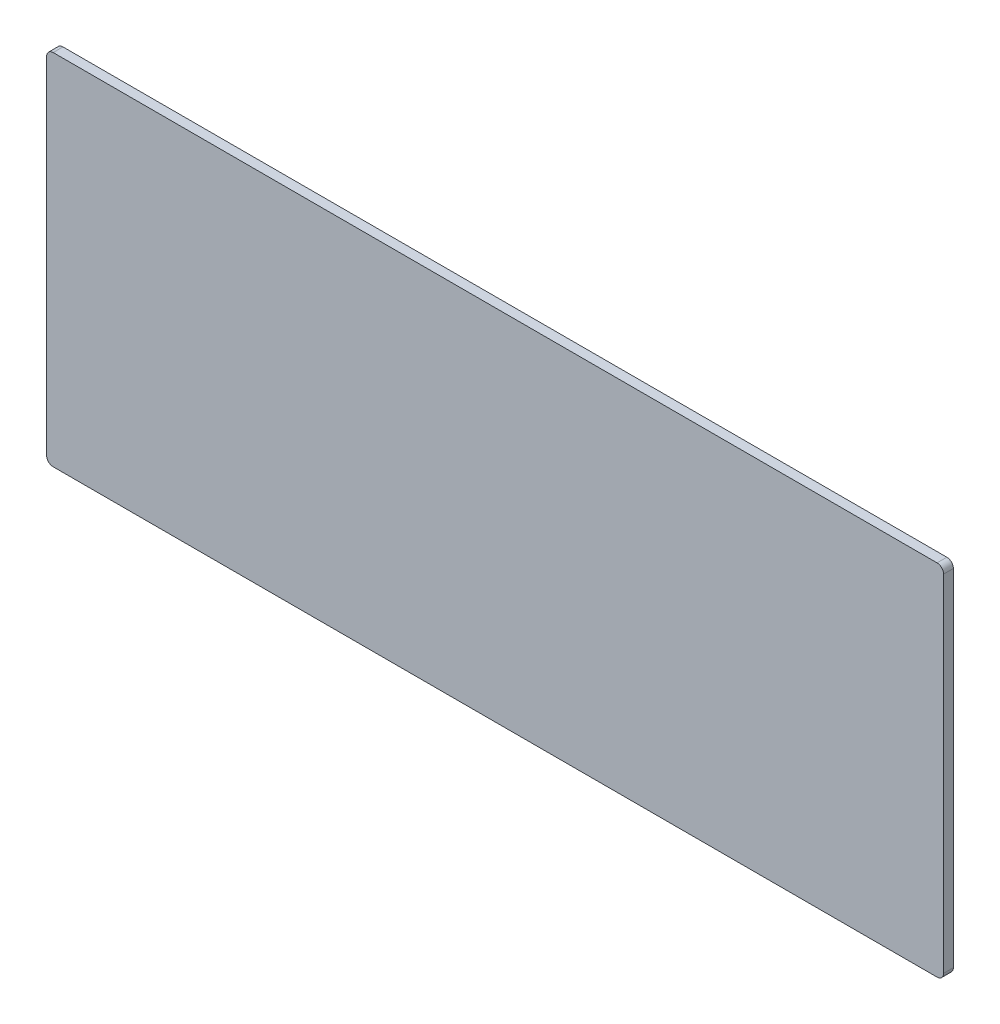
ISO-10303-21;
HEADER;
FILE_DESCRIPTION(('STEP AP214'),'2;1');
FILE_NAME('part.step','',(''),(''),'','','');
FILE_SCHEMA(('AUTOMOTIVE_DESIGN { 1 0 10303 214 1 1 1 1 }'));
ENDSEC;
DATA;
#1=APPLICATION_CONTEXT('core data for automotive mechanical design processes');
#2=APPLICATION_PROTOCOL_DEFINITION('international standard','automotive_design',2000,#1);
#3=PRODUCT_CONTEXT('',#1,'mechanical');
#4=PRODUCT('Part','Part','',(#3));
#5=PRODUCT_RELATED_PRODUCT_CATEGORY('part','',(#4));
#6=PRODUCT_DEFINITION_FORMATION('','',#4);
#7=PRODUCT_DEFINITION_CONTEXT('part definition',#1,'design');
#8=PRODUCT_DEFINITION('design','',#6,#7);
#9=PRODUCT_DEFINITION_SHAPE('','',#8);
#10=(LENGTH_UNIT() NAMED_UNIT(*) SI_UNIT(.MILLI.,.METRE.));
#11=(NAMED_UNIT(*) PLANE_ANGLE_UNIT() SI_UNIT($,.RADIAN.));
#12=(NAMED_UNIT(*) SI_UNIT($,.STERADIAN.) SOLID_ANGLE_UNIT());
#13=UNCERTAINTY_MEASURE_WITH_UNIT(LENGTH_MEASURE(1.E-05),#10,'distance_accuracy_value','');
#14=(GEOMETRIC_REPRESENTATION_CONTEXT(3) GLOBAL_UNCERTAINTY_ASSIGNED_CONTEXT((#13)) GLOBAL_UNIT_ASSIGNED_CONTEXT((#10,
#11,#12)) REPRESENTATION_CONTEXT('',''));
#15=CARTESIAN_POINT('',(0.,0.,0.));
#16=DIRECTION('',(0.,0.,1.));
#17=DIRECTION('',(1.,0.,0.));
#18=AXIS2_PLACEMENT_3D('',#15,#16,#17);
#19=CARTESIAN_POINT('',(-135.5,-35.4960998439938,-3.));
#20=DIRECTION('',(0.,0.,1.));
#21=DIRECTION('',(1.,0.,0.));
#22=AXIS2_PLACEMENT_3D('',#19,#20,#21);
#23=CYLINDRICAL_SURFACE('',#22,2.);
#24=CARTESIAN_POINT('',(-135.5,-35.4960998439938,0.));
#25=DIRECTION('',(0.,0.,1.));
#26=DIRECTION('',(1.,0.,0.));
#27=AXIS2_PLACEMENT_3D('',#24,#25,#26);
#28=CIRCLE('',#27,2.);
#29=CARTESIAN_POINT('',(-137.5,-35.4960998439938,0.));
#30=VERTEX_POINT('',#29);
#31=CARTESIAN_POINT('',(-135.5,-37.4960998439938,0.));
#32=VERTEX_POINT('',#31);
#33=EDGE_CURVE('E133',#30,#32,#28,.T.);
#34=ORIENTED_EDGE('',*,*,#33,.F.);
#35=DIRECTION('',(0.,0.,1.));
#36=VECTOR('',#35,1.);
#37=CARTESIAN_POINT('',(-137.5,-35.4960998439938,-3.));
#38=LINE('',#37,#36);
#39=CARTESIAN_POINT('',(-137.5,-35.4960998439938,-3.));
#40=VERTEX_POINT('',#39);
#41=EDGE_CURVE('E11',#40,#30,#38,.T.);
#42=ORIENTED_EDGE('',*,*,#41,.F.);
#43=CARTESIAN_POINT('',(-135.5,-35.4960998439938,-3.));
#44=DIRECTION('',(0.,0.,1.));
#45=DIRECTION('',(1.,0.,0.));
#46=AXIS2_PLACEMENT_3D('',#43,#44,#45);
#47=CIRCLE('',#46,2.);
#48=CARTESIAN_POINT('',(-135.5,-37.4960998439938,-3.));
#49=VERTEX_POINT('',#48);
#50=EDGE_CURVE('E153',#40,#49,#47,.T.);
#51=ORIENTED_EDGE('',*,*,#50,.T.);
#52=DIRECTION('',(0.,0.,1.));
#53=VECTOR('',#52,1.);
#54=CARTESIAN_POINT('',(-135.5,-37.4960998439938,-3.));
#55=LINE('',#54,#53);
#56=EDGE_CURVE('E39',#49,#32,#55,.T.);
#57=ORIENTED_EDGE('',*,*,#56,.T.);
#58=EDGE_LOOP('',(#34,#42,#51,#57));
#59=FACE_BOUND('',#58,.T.);
#60=ADVANCED_FACE('F36',(#59),#23,.T.);
#61=CARTESIAN_POINT('',(-137.5,-35.4960998439938,-3.));
#62=DIRECTION('',(-1.,0.,0.));
#63=DIRECTION('',(0.,0.,1.));
#64=AXIS2_PLACEMENT_3D('',#61,#62,#63);
#65=PLANE('',#64);
#66=DIRECTION('',(0.,-1.,0.));
#67=VECTOR('',#66,1.);
#68=CARTESIAN_POINT('',(-137.5,-35.4960998439938,0.));
#69=LINE('',#68,#67);
#70=CARTESIAN_POINT('',(-137.5,70.5039001560062,0.));
#71=VERTEX_POINT('',#70);
#72=EDGE_CURVE('E151',#71,#30,#69,.T.);
#73=ORIENTED_EDGE('',*,*,#72,.F.);
#74=DIRECTION('',(0.,0.,1.));
#75=VECTOR('',#74,1.);
#76=CARTESIAN_POINT('',(-137.5,70.5039001560062,-3.));
#77=LINE('',#76,#75);
#78=CARTESIAN_POINT('',(-137.5,70.5039001560062,-3.));
#79=VERTEX_POINT('',#78);
#80=EDGE_CURVE('E45',#79,#71,#77,.T.);
#81=ORIENTED_EDGE('',*,*,#80,.F.);
#82=DIRECTION('',(0.,-1.,0.));
#83=VECTOR('',#82,1.);
#84=CARTESIAN_POINT('',(-137.5,-35.4960998439938,-3.));
#85=LINE('',#84,#83);
#86=EDGE_CURVE('E123',#79,#40,#85,.T.);
#87=ORIENTED_EDGE('',*,*,#86,.T.);
#88=ORIENTED_EDGE('',*,*,#41,.T.);
#89=EDGE_LOOP('',(#73,#81,#87,#88));
#90=FACE_BOUND('',#89,.T.);
#91=ADVANCED_FACE('F165',(#90),#65,.T.);
#92=CARTESIAN_POINT('',(-135.5,70.5039001560062,-3.));
#93=DIRECTION('',(0.,0.,1.));
#94=DIRECTION('',(1.,0.,0.));
#95=AXIS2_PLACEMENT_3D('',#92,#93,#94);
#96=CYLINDRICAL_SURFACE('',#95,2.);
#97=CARTESIAN_POINT('',(-135.5,70.5039001560062,0.));
#98=DIRECTION('',(0.,0.,1.));
#99=DIRECTION('',(1.,0.,0.));
#100=AXIS2_PLACEMENT_3D('',#97,#98,#99);
#101=CIRCLE('',#100,2.);
#102=CARTESIAN_POINT('',(-135.5,72.5039001560062,0.));
#103=VERTEX_POINT('',#102);
#104=EDGE_CURVE('E110',#103,#71,#101,.T.);
#105=ORIENTED_EDGE('',*,*,#104,.F.);
#106=DIRECTION('',(0.,0.,1.));
#107=VECTOR('',#106,1.);
#108=CARTESIAN_POINT('',(-135.5,72.5039001560062,-3.));
#109=LINE('',#108,#107);
#110=CARTESIAN_POINT('',(-135.5,72.5039001560062,-3.));
#111=VERTEX_POINT('',#110);
#112=EDGE_CURVE('E105',#111,#103,#109,.T.);
#113=ORIENTED_EDGE('',*,*,#112,.F.);
#114=CARTESIAN_POINT('',(-135.5,70.5039001560062,-3.));
#115=DIRECTION('',(0.,0.,1.));
#116=DIRECTION('',(1.,0.,0.));
#117=AXIS2_PLACEMENT_3D('',#114,#115,#116);
#118=CIRCLE('',#117,2.);
#119=EDGE_CURVE('E108',#111,#79,#118,.T.);
#120=ORIENTED_EDGE('',*,*,#119,.T.);
#121=ORIENTED_EDGE('',*,*,#80,.T.);
#122=EDGE_LOOP('',(#105,#113,#120,#121));
#123=FACE_BOUND('',#122,.T.);
#124=ADVANCED_FACE('F107',(#123),#96,.T.);
#125=CARTESIAN_POINT('',(-135.5,72.5039001560062,-3.));
#126=DIRECTION('',(0.,1.,0.));
#127=DIRECTION('',(0.,0.,1.));
#128=AXIS2_PLACEMENT_3D('',#125,#126,#127);
#129=PLANE('',#128);
#130=DIRECTION('',(-1.,0.,0.));
#131=VECTOR('',#130,1.);
#132=CARTESIAN_POINT('',(-135.5,72.5039001560062,0.));
#133=LINE('',#132,#131);
#134=CARTESIAN_POINT('',(135.5,72.5039001560062,0.));
#135=VERTEX_POINT('',#134);
#136=EDGE_CURVE('E148',#135,#103,#133,.T.);
#137=ORIENTED_EDGE('',*,*,#136,.F.);
#138=DIRECTION('',(0.,0.,1.));
#139=VECTOR('',#138,1.);
#140=CARTESIAN_POINT('',(135.5,72.5039001560062,-3.));
#141=LINE('',#140,#139);
#142=CARTESIAN_POINT('',(135.5,72.5039001560062,-3.));
#143=VERTEX_POINT('',#142);
#144=EDGE_CURVE('E115',#143,#135,#141,.T.);
#145=ORIENTED_EDGE('',*,*,#144,.F.);
#146=DIRECTION('',(-1.,0.,0.));
#147=VECTOR('',#146,1.);
#148=CARTESIAN_POINT('',(-135.5,72.5039001560062,-3.));
#149=LINE('',#148,#147);
#150=EDGE_CURVE('E121',#143,#111,#149,.T.);
#151=ORIENTED_EDGE('',*,*,#150,.T.);
#152=ORIENTED_EDGE('',*,*,#112,.T.);
#153=EDGE_LOOP('',(#137,#145,#151,#152));
#154=FACE_BOUND('',#153,.T.);
#155=ADVANCED_FACE('F125',(#154),#129,.T.);
#156=CARTESIAN_POINT('',(135.5,70.5039001560062,-3.));
#157=DIRECTION('',(0.,0.,1.));
#158=DIRECTION('',(1.,0.,0.));
#159=AXIS2_PLACEMENT_3D('',#156,#157,#158);
#160=CYLINDRICAL_SURFACE('',#159,2.);
#161=CARTESIAN_POINT('',(135.5,70.5039001560062,0.));
#162=DIRECTION('',(0.,0.,1.));
#163=DIRECTION('',(1.,0.,0.));
#164=AXIS2_PLACEMENT_3D('',#161,#162,#163);
#165=CIRCLE('',#164,2.);
#166=CARTESIAN_POINT('',(137.5,70.5039001560062,0.));
#167=VERTEX_POINT('',#166);
#168=EDGE_CURVE('E145',#167,#135,#165,.T.);
#169=ORIENTED_EDGE('',*,*,#168,.F.);
#170=DIRECTION('',(0.,0.,1.));
#171=VECTOR('',#170,1.);
#172=CARTESIAN_POINT('',(137.5,70.5039001560062,-3.));
#173=LINE('',#172,#171);
#174=CARTESIAN_POINT('',(137.5,70.5039001560062,-3.));
#175=VERTEX_POINT('',#174);
#176=EDGE_CURVE('E157',#175,#167,#173,.T.);
#177=ORIENTED_EDGE('',*,*,#176,.F.);
#178=CARTESIAN_POINT('',(135.5,70.5039001560062,-3.));
#179=DIRECTION('',(0.,0.,1.));
#180=DIRECTION('',(1.,0.,0.));
#181=AXIS2_PLACEMENT_3D('',#178,#179,#180);
#182=CIRCLE('',#181,2.);
#183=EDGE_CURVE('E126',#175,#143,#182,.T.);
#184=ORIENTED_EDGE('',*,*,#183,.T.);
#185=ORIENTED_EDGE('',*,*,#144,.T.);
#186=EDGE_LOOP('',(#169,#177,#184,#185));
#187=FACE_BOUND('',#186,.T.);
#188=ADVANCED_FACE('F178',(#187),#160,.T.);
#189=CARTESIAN_POINT('',(137.5,-35.4960998439938,-3.));
#190=DIRECTION('',(1.,0.,0.));
#191=DIRECTION('',(0.,0.,-1.));
#192=AXIS2_PLACEMENT_3D('',#189,#190,#191);
#193=PLANE('',#192);
#194=DIRECTION('',(0.,1.,0.));
#195=VECTOR('',#194,1.);
#196=CARTESIAN_POINT('',(137.5,-35.4960998439938,0.));
#197=LINE('',#196,#195);
#198=CARTESIAN_POINT('',(137.5,-35.4960998439938,0.));
#199=VERTEX_POINT('',#198);
#200=EDGE_CURVE('E142',#199,#167,#197,.T.);
#201=ORIENTED_EDGE('',*,*,#200,.F.);
#202=DIRECTION('',(0.,0.,1.));
#203=VECTOR('',#202,1.);
#204=CARTESIAN_POINT('',(137.5,-35.4960998439938,-3.));
#205=LINE('',#204,#203);
#206=CARTESIAN_POINT('',(137.5,-35.4960998439938,-3.));
#207=VERTEX_POINT('',#206);
#208=EDGE_CURVE('E159',#207,#199,#205,.T.);
#209=ORIENTED_EDGE('',*,*,#208,.F.);
#210=DIRECTION('',(0.,1.,0.));
#211=VECTOR('',#210,1.);
#212=CARTESIAN_POINT('',(137.5,-35.4960998439938,-3.));
#213=LINE('',#212,#211);
#214=EDGE_CURVE('E128',#207,#175,#213,.T.);
#215=ORIENTED_EDGE('',*,*,#214,.T.);
#216=ORIENTED_EDGE('',*,*,#176,.T.);
#217=EDGE_LOOP('',(#201,#209,#215,#216));
#218=FACE_BOUND('',#217,.T.);
#219=ADVANCED_FACE('F181',(#218),#193,.T.);
#220=CARTESIAN_POINT('',(135.5,-35.4960998439938,-3.));
#221=DIRECTION('',(0.,0.,1.));
#222=DIRECTION('',(1.,0.,0.));
#223=AXIS2_PLACEMENT_3D('',#220,#221,#222);
#224=CYLINDRICAL_SURFACE('',#223,2.);
#225=CARTESIAN_POINT('',(135.5,-35.4960998439938,0.));
#226=DIRECTION('',(0.,0.,1.));
#227=DIRECTION('',(-1.,0.,0.));
#228=AXIS2_PLACEMENT_3D('',#225,#226,#227);
#229=CIRCLE('',#228,2.);
#230=CARTESIAN_POINT('',(135.5,-37.4960998439938,0.));
#231=VERTEX_POINT('',#230);
#232=EDGE_CURVE('E139',#231,#199,#229,.T.);
#233=ORIENTED_EDGE('',*,*,#232,.F.);
#234=DIRECTION('',(0.,0.,1.));
#235=VECTOR('',#234,1.);
#236=CARTESIAN_POINT('',(135.5,-37.4960998439938,-3.));
#237=LINE('',#236,#235);
#238=CARTESIAN_POINT('',(135.5,-37.4960998439938,-3.));
#239=VERTEX_POINT('',#238);
#240=EDGE_CURVE('E160',#239,#231,#237,.T.);
#241=ORIENTED_EDGE('',*,*,#240,.F.);
#242=CARTESIAN_POINT('',(135.5,-35.4960998439938,-3.));
#243=DIRECTION('',(0.,0.,1.));
#244=DIRECTION('',(-1.,0.,0.));
#245=AXIS2_PLACEMENT_3D('',#242,#243,#244);
#246=CIRCLE('',#245,2.);
#247=EDGE_CURVE('E276',#239,#207,#246,.T.);
#248=ORIENTED_EDGE('',*,*,#247,.T.);
#249=ORIENTED_EDGE('',*,*,#208,.T.);
#250=EDGE_LOOP('',(#233,#241,#248,#249));
#251=FACE_BOUND('',#250,.T.);
#252=ADVANCED_FACE('F185',(#251),#224,.T.);
#253=CARTESIAN_POINT('',(-135.5,-37.4960998439938,-3.));
#254=DIRECTION('',(0.,-1.,0.));
#255=DIRECTION('',(0.,0.,-1.));
#256=AXIS2_PLACEMENT_3D('',#253,#254,#255);
#257=PLANE('',#256);
#258=DIRECTION('',(1.,0.,0.));
#259=VECTOR('',#258,1.);
#260=CARTESIAN_POINT('',(-135.5,-37.4960998439938,0.));
#261=LINE('',#260,#259);
#262=EDGE_CURVE('E136',#32,#231,#261,.T.);
#263=ORIENTED_EDGE('',*,*,#262,.F.);
#264=ORIENTED_EDGE('',*,*,#56,.F.);
#265=DIRECTION('',(1.,0.,0.));
#266=VECTOR('',#265,1.);
#267=CARTESIAN_POINT('',(-135.5,-37.4960998439938,-3.));
#268=LINE('',#267,#266);
#269=EDGE_CURVE('E277',#49,#239,#268,.T.);
#270=ORIENTED_EDGE('',*,*,#269,.T.);
#271=ORIENTED_EDGE('',*,*,#240,.T.);
#272=EDGE_LOOP('',(#263,#264,#270,#271));
#273=FACE_BOUND('',#272,.T.);
#274=ADVANCED_FACE('F162',(#273),#257,.T.);
#275=CARTESIAN_POINT('',(-135.5,-35.4960998439938,-3.));
#276=DIRECTION('',(0.,0.,1.));
#277=DIRECTION('',(1.,0.,0.));
#278=AXIS2_PLACEMENT_3D('',#275,#276,#277);
#279=PLANE('',#278);
#280=ORIENTED_EDGE('',*,*,#50,.F.);
#281=ORIENTED_EDGE('',*,*,#86,.F.);
#282=ORIENTED_EDGE('',*,*,#119,.F.);
#283=ORIENTED_EDGE('',*,*,#150,.F.);
#284=ORIENTED_EDGE('',*,*,#183,.F.);
#285=ORIENTED_EDGE('',*,*,#214,.F.);
#286=ORIENTED_EDGE('',*,*,#247,.F.);
#287=ORIENTED_EDGE('',*,*,#269,.F.);
#288=EDGE_LOOP('',(#280,#281,#282,#283,#284,#285,#286,#287));
#289=FACE_BOUND('',#288,.T.);
#290=ADVANCED_FACE('F119',(#289),#279,.F.);
#291=CARTESIAN_POINT('',(-135.5,-35.4960998439938,0.));
#292=DIRECTION('',(0.,0.,1.));
#293=DIRECTION('',(1.,0.,0.));
#294=AXIS2_PLACEMENT_3D('',#291,#292,#293);
#295=PLANE('',#294);
#296=ORIENTED_EDGE('',*,*,#33,.T.);
#297=ORIENTED_EDGE('',*,*,#262,.T.);
#298=ORIENTED_EDGE('',*,*,#232,.T.);
#299=ORIENTED_EDGE('',*,*,#200,.T.);
#300=ORIENTED_EDGE('',*,*,#168,.T.);
#301=ORIENTED_EDGE('',*,*,#136,.T.);
#302=ORIENTED_EDGE('',*,*,#104,.T.);
#303=ORIENTED_EDGE('',*,*,#72,.T.);
#304=EDGE_LOOP('',(#296,#297,#298,#299,#300,#301,#302,#303));
#305=FACE_BOUND('',#304,.T.);
#306=ADVANCED_FACE('F164',(#305),#295,.T.);
#307=CLOSED_SHELL('',(#60,#91,#124,#155,#188,#219,#252,#274,#290,#306));
#308=MANIFOLD_SOLID_BREP('B2',#307);
#309=ADVANCED_BREP_SHAPE_REPRESENTATION('',(#18,#308),#14);
#310=SHAPE_DEFINITION_REPRESENTATION(#9,#309);
ENDSEC;
END-ISO-10303-21;
